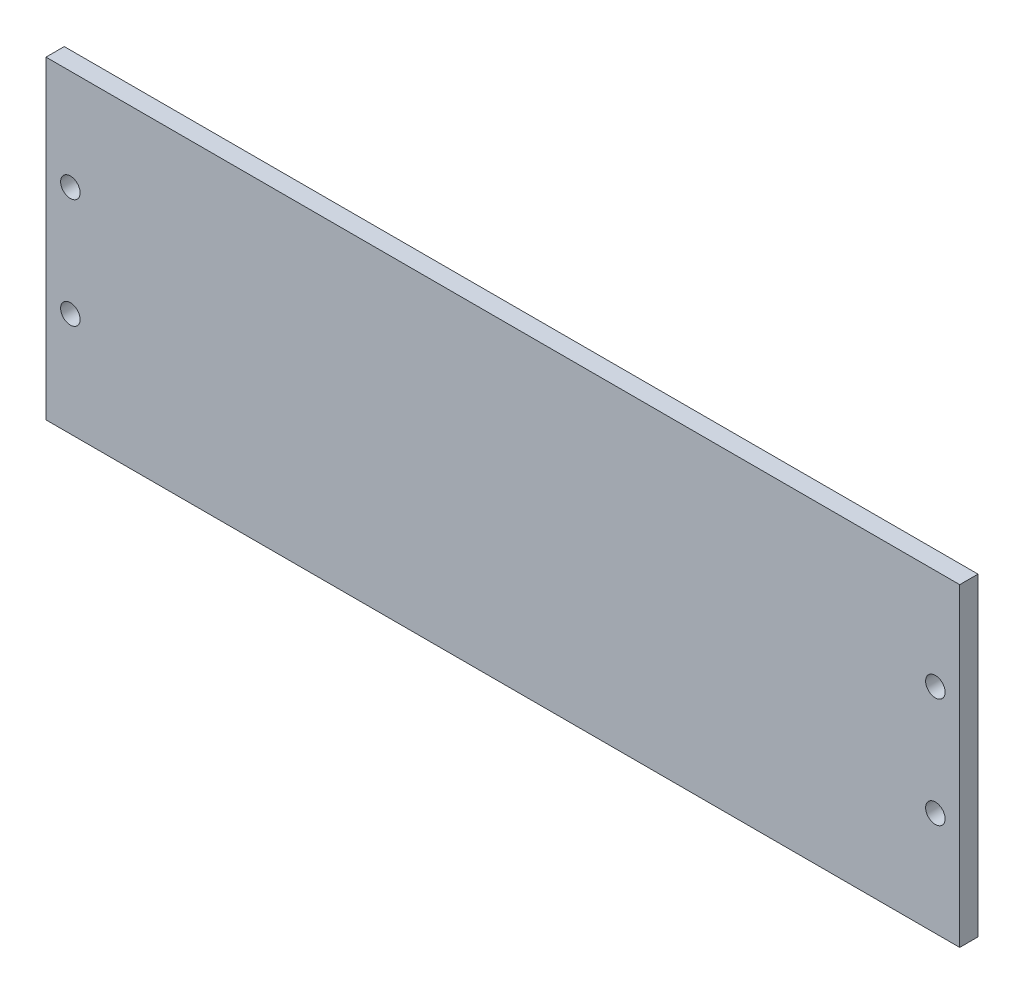
ISO-10303-21;
HEADER;
FILE_DESCRIPTION(('STEP AP214'),'2;1');
FILE_NAME('part.step','',(''),(''),'','','');
FILE_SCHEMA(('AUTOMOTIVE_DESIGN { 1 0 10303 214 1 1 1 1 }'));
ENDSEC;
DATA;
#1=APPLICATION_CONTEXT('core data for automotive mechanical design processes');
#2=APPLICATION_PROTOCOL_DEFINITION('international standard','automotive_design',2000,#1);
#3=PRODUCT_CONTEXT('',#1,'mechanical');
#4=PRODUCT('Part','Part','',(#3));
#5=PRODUCT_RELATED_PRODUCT_CATEGORY('part','',(#4));
#6=PRODUCT_DEFINITION_FORMATION('','',#4);
#7=PRODUCT_DEFINITION_CONTEXT('part definition',#1,'design');
#8=PRODUCT_DEFINITION('design','',#6,#7);
#9=PRODUCT_DEFINITION_SHAPE('','',#8);
#10=(LENGTH_UNIT() NAMED_UNIT(*) SI_UNIT(.MILLI.,.METRE.));
#11=(NAMED_UNIT(*) PLANE_ANGLE_UNIT() SI_UNIT($,.RADIAN.));
#12=(NAMED_UNIT(*) SI_UNIT($,.STERADIAN.) SOLID_ANGLE_UNIT());
#13=UNCERTAINTY_MEASURE_WITH_UNIT(LENGTH_MEASURE(1.E-05),#10,'distance_accuracy_value','');
#14=(GEOMETRIC_REPRESENTATION_CONTEXT(3) GLOBAL_UNCERTAINTY_ASSIGNED_CONTEXT((#13)) GLOBAL_UNIT_ASSIGNED_CONTEXT((#10,
#11,#12)) REPRESENTATION_CONTEXT('',''));
#15=CARTESIAN_POINT('',(0.,0.,0.));
#16=DIRECTION('',(0.,0.,1.));
#17=DIRECTION('',(1.,0.,0.));
#18=AXIS2_PLACEMENT_3D('',#15,#16,#17);
#19=CARTESIAN_POINT('',(-47.1117165948132,42.139739940599,-3.));
#20=DIRECTION('',(0.,-1.,0.));
#21=DIRECTION('',(1.,0.,0.));
#22=AXIS2_PLACEMENT_3D('',#19,#20,#21);
#23=PLANE('',#22);
#24=DIRECTION('',(1.,0.,0.));
#25=VECTOR('',#24,1.);
#26=CARTESIAN_POINT('',(-47.1117165948132,42.139739940599,0.));
#27=LINE('',#26,#25);
#28=CARTESIAN_POINT('',(-47.1117165948132,42.139739940599,0.));
#29=VERTEX_POINT('',#28);
#30=CARTESIAN_POINT('',(102.888283405187,42.139739940599,0.));
#31=VERTEX_POINT('',#30);
#32=EDGE_CURVE('E119',#29,#31,#27,.T.);
#33=ORIENTED_EDGE('',*,*,#32,.F.);
#34=DIRECTION('',(0.,0.,1.));
#35=VECTOR('',#34,1.);
#36=CARTESIAN_POINT('',(-47.1117165948132,42.139739940599,-3.));
#37=LINE('',#36,#35);
#38=CARTESIAN_POINT('',(-47.1117165948132,42.139739940599,-3.));
#39=VERTEX_POINT('',#38);
#40=EDGE_CURVE('E11',#39,#29,#37,.T.);
#41=ORIENTED_EDGE('',*,*,#40,.F.);
#42=DIRECTION('',(1.,0.,0.));
#43=VECTOR('',#42,1.);
#44=CARTESIAN_POINT('',(-47.1117165948132,42.139739940599,-3.));
#45=LINE('',#44,#43);
#46=CARTESIAN_POINT('',(102.888283405187,42.139739940599,-3.));
#47=VERTEX_POINT('',#46);
#48=EDGE_CURVE('E109',#39,#47,#45,.T.);
#49=ORIENTED_EDGE('',*,*,#48,.T.);
#50=DIRECTION('',(0.,0.,1.));
#51=VECTOR('',#50,1.);
#52=CARTESIAN_POINT('',(102.888283405187,42.139739940599,-3.));
#53=LINE('',#52,#51);
#54=EDGE_CURVE('E50',#47,#31,#53,.T.);
#55=ORIENTED_EDGE('',*,*,#54,.T.);
#56=EDGE_LOOP('',(#33,#41,#49,#55));
#57=FACE_BOUND('',#56,.T.);
#58=ADVANCED_FACE('F47',(#57),#23,.T.);
#59=CARTESIAN_POINT('',(-47.1117165948132,42.139739940599,-3.));
#60=DIRECTION('',(-1.,0.,0.));
#61=DIRECTION('',(0.,0.,1.));
#62=AXIS2_PLACEMENT_3D('',#59,#60,#61);
#63=PLANE('',#62);
#64=DIRECTION('',(0.,-1.,0.));
#65=VECTOR('',#64,1.);
#66=CARTESIAN_POINT('',(-47.1117165948132,42.139739940599,0.));
#67=LINE('',#66,#65);
#68=CARTESIAN_POINT('',(-47.1117165948132,93.7182566094569,0.));
#69=VERTEX_POINT('',#68);
#70=EDGE_CURVE('E113',#69,#29,#67,.T.);
#71=ORIENTED_EDGE('',*,*,#70,.F.);
#72=DIRECTION('',(0.,0.,1.));
#73=VECTOR('',#72,1.);
#74=CARTESIAN_POINT('',(-47.1117165948132,93.7182566094569,-3.));
#75=LINE('',#74,#73);
#76=CARTESIAN_POINT('',(-47.1117165948132,93.7182566094569,-3.));
#77=VERTEX_POINT('',#76);
#78=EDGE_CURVE('E57',#77,#69,#75,.T.);
#79=ORIENTED_EDGE('',*,*,#78,.F.);
#80=DIRECTION('',(0.,-1.,0.));
#81=VECTOR('',#80,1.);
#82=CARTESIAN_POINT('',(-47.1117165948132,42.139739940599,-3.));
#83=LINE('',#82,#81);
#84=EDGE_CURVE('E104',#77,#39,#83,.T.);
#85=ORIENTED_EDGE('',*,*,#84,.T.);
#86=ORIENTED_EDGE('',*,*,#40,.T.);
#87=EDGE_LOOP('',(#71,#79,#85,#86));
#88=FACE_BOUND('',#87,.T.);
#89=ADVANCED_FACE('F142',(#88),#63,.T.);
#90=CARTESIAN_POINT('',(-47.1117165948132,93.7182566094569,-3.));
#91=DIRECTION('',(0.,1.,0.));
#92=DIRECTION('',(-1.,0.,0.));
#93=AXIS2_PLACEMENT_3D('',#90,#91,#92);
#94=PLANE('',#93);
#95=DIRECTION('',(-1.,0.,0.));
#96=VECTOR('',#95,1.);
#97=CARTESIAN_POINT('',(-47.1117165948132,93.7182566094569,0.));
#98=LINE('',#97,#96);
#99=CARTESIAN_POINT('',(102.888283405187,93.7182566094569,0.));
#100=VERTEX_POINT('',#99);
#101=EDGE_CURVE('E98',#100,#69,#98,.T.);
#102=ORIENTED_EDGE('',*,*,#101,.F.);
#103=DIRECTION('',(0.,0.,1.));
#104=VECTOR('',#103,1.);
#105=CARTESIAN_POINT('',(102.888283405187,93.7182566094569,-3.));
#106=LINE('',#105,#104);
#107=CARTESIAN_POINT('',(102.888283405187,93.7182566094569,-3.));
#108=VERTEX_POINT('',#107);
#109=EDGE_CURVE('E93',#108,#100,#106,.T.);
#110=ORIENTED_EDGE('',*,*,#109,.F.);
#111=DIRECTION('',(-1.,0.,0.));
#112=VECTOR('',#111,1.);
#113=CARTESIAN_POINT('',(-47.1117165948132,93.7182566094569,-3.));
#114=LINE('',#113,#112);
#115=EDGE_CURVE('E96',#108,#77,#114,.T.);
#116=ORIENTED_EDGE('',*,*,#115,.T.);
#117=ORIENTED_EDGE('',*,*,#78,.T.);
#118=EDGE_LOOP('',(#102,#110,#116,#117));
#119=FACE_BOUND('',#118,.T.);
#120=ADVANCED_FACE('F95',(#119),#94,.T.);
#121=CARTESIAN_POINT('',(102.888283405187,42.139739940599,-3.));
#122=DIRECTION('',(1.,0.,0.));
#123=DIRECTION('',(0.,0.,-1.));
#124=AXIS2_PLACEMENT_3D('',#121,#122,#123);
#125=PLANE('',#124);
#126=DIRECTION('',(0.,1.,0.));
#127=VECTOR('',#126,1.);
#128=CARTESIAN_POINT('',(102.888283405187,42.139739940599,0.));
#129=LINE('',#128,#127);
#130=EDGE_CURVE('E123',#31,#100,#129,.T.);
#131=ORIENTED_EDGE('',*,*,#130,.F.);
#132=ORIENTED_EDGE('',*,*,#54,.F.);
#133=DIRECTION('',(0.,1.,0.));
#134=VECTOR('',#133,1.);
#135=CARTESIAN_POINT('',(102.888283405187,42.139739940599,-3.));
#136=LINE('',#135,#134);
#137=EDGE_CURVE('E103',#47,#108,#136,.T.);
#138=ORIENTED_EDGE('',*,*,#137,.T.);
#139=ORIENTED_EDGE('',*,*,#109,.T.);
#140=EDGE_LOOP('',(#131,#132,#138,#139));
#141=FACE_BOUND('',#140,.T.);
#142=ADVANCED_FACE('F107',(#141),#125,.T.);
#143=CARTESIAN_POINT('',(0.,0.,-3.));
#144=DIRECTION('',(0.,0.,1.));
#145=DIRECTION('',(1.,0.,0.));
#146=AXIS2_PLACEMENT_3D('',#143,#144,#145);
#147=PLANE('',#146);
#148=CARTESIAN_POINT('',(98.8882834051867,77.2182566094569,-3.));
#149=DIRECTION('',(0.,0.,1.));
#150=DIRECTION('',(-1.,0.,0.));
#151=AXIS2_PLACEMENT_3D('',#148,#149,#150);
#152=CIRCLE('',#151,1.59999999999996);
#153=CARTESIAN_POINT('',(97.2882834051868,77.2182566094569,-3.));
#154=VERTEX_POINT('',#153);
#155=EDGE_CURVE('E183',#154,#154,#152,.T.);
#156=ORIENTED_EDGE('',*,*,#155,.T.);
#157=EDGE_LOOP('',(#156));
#158=FACE_BOUND('',#157,.T.);
#159=CARTESIAN_POINT('',(98.8882834051867,59.2182566094569,-3.));
#160=DIRECTION('',(0.,0.,1.));
#161=DIRECTION('',(-1.,0.,0.));
#162=AXIS2_PLACEMENT_3D('',#159,#160,#161);
#163=CIRCLE('',#162,1.59999999999997);
#164=CARTESIAN_POINT('',(97.2882834051868,59.2182566094569,-3.));
#165=VERTEX_POINT('',#164);
#166=EDGE_CURVE('E194',#165,#165,#163,.T.);
#167=ORIENTED_EDGE('',*,*,#166,.T.);
#168=EDGE_LOOP('',(#167));
#169=FACE_BOUND('',#168,.T.);
#170=CARTESIAN_POINT('',(-43.1117165948132,59.2182566094569,-3.));
#171=DIRECTION('',(0.,0.,1.));
#172=DIRECTION('',(1.,0.,0.));
#173=AXIS2_PLACEMENT_3D('',#170,#171,#172);
#174=CIRCLE('',#173,1.60000000000001);
#175=CARTESIAN_POINT('',(-41.5117165948132,59.2182566094569,-3.));
#176=VERTEX_POINT('',#175);
#177=EDGE_CURVE('E202',#176,#176,#174,.T.);
#178=ORIENTED_EDGE('',*,*,#177,.T.);
#179=EDGE_LOOP('',(#178));
#180=FACE_BOUND('',#179,.T.);
#181=CARTESIAN_POINT('',(-43.1117165948132,77.2182566094569,-3.));
#182=DIRECTION('',(0.,0.,1.));
#183=DIRECTION('',(1.,0.,0.));
#184=AXIS2_PLACEMENT_3D('',#181,#182,#183);
#185=CIRCLE('',#184,1.59999999999998);
#186=CARTESIAN_POINT('',(-41.5117165948132,77.2182566094569,-3.));
#187=VERTEX_POINT('',#186);
#188=EDGE_CURVE('E124',#187,#187,#185,.T.);
#189=ORIENTED_EDGE('',*,*,#188,.T.);
#190=EDGE_LOOP('',(#189));
#191=FACE_BOUND('',#190,.T.);
#192=ORIENTED_EDGE('',*,*,#48,.F.);
#193=ORIENTED_EDGE('',*,*,#84,.F.);
#194=ORIENTED_EDGE('',*,*,#115,.F.);
#195=ORIENTED_EDGE('',*,*,#137,.F.);
#196=EDGE_LOOP('',(#192,#193,#194,#195));
#197=FACE_BOUND('',#196,.T.);
#198=ADVANCED_FACE('F102',(#158,#169,#180,#191,#197),#147,.F.);
#199=CARTESIAN_POINT('',(0.,0.,0.));
#200=DIRECTION('',(0.,0.,1.));
#201=DIRECTION('',(1.,0.,0.));
#202=AXIS2_PLACEMENT_3D('',#199,#200,#201);
#203=PLANE('',#202);
#204=CARTESIAN_POINT('',(98.8882834051867,77.2182566094569,0.));
#205=DIRECTION('',(0.,0.,1.));
#206=DIRECTION('',(-1.,0.,0.));
#207=AXIS2_PLACEMENT_3D('',#204,#205,#206);
#208=CIRCLE('',#207,1.59999999999996);
#209=CARTESIAN_POINT('',(97.2882834051868,77.2182566094569,0.));
#210=VERTEX_POINT('',#209);
#211=EDGE_CURVE('E186',#210,#210,#208,.T.);
#212=ORIENTED_EDGE('',*,*,#211,.F.);
#213=EDGE_LOOP('',(#212));
#214=FACE_BOUND('',#213,.T.);
#215=CARTESIAN_POINT('',(98.8882834051867,59.2182566094569,0.));
#216=DIRECTION('',(0.,0.,1.));
#217=DIRECTION('',(-1.,0.,0.));
#218=AXIS2_PLACEMENT_3D('',#215,#216,#217);
#219=CIRCLE('',#218,1.59999999999997);
#220=CARTESIAN_POINT('',(97.2882834051868,59.2182566094569,0.));
#221=VERTEX_POINT('',#220);
#222=EDGE_CURVE('E191',#221,#221,#219,.T.);
#223=ORIENTED_EDGE('',*,*,#222,.F.);
#224=EDGE_LOOP('',(#223));
#225=FACE_BOUND('',#224,.T.);
#226=CARTESIAN_POINT('',(-43.1117165948132,59.2182566094569,0.));
#227=DIRECTION('',(0.,0.,1.));
#228=DIRECTION('',(1.,0.,0.));
#229=AXIS2_PLACEMENT_3D('',#226,#227,#228);
#230=CIRCLE('',#229,1.60000000000001);
#231=CARTESIAN_POINT('',(-41.5117165948132,59.2182566094569,0.));
#232=VERTEX_POINT('',#231);
#233=EDGE_CURVE('E198',#232,#232,#230,.T.);
#234=ORIENTED_EDGE('',*,*,#233,.F.);
#235=EDGE_LOOP('',(#234));
#236=FACE_BOUND('',#235,.T.);
#237=CARTESIAN_POINT('',(-43.1117165948132,77.2182566094569,0.));
#238=DIRECTION('',(0.,0.,1.));
#239=DIRECTION('',(1.,0.,0.));
#240=AXIS2_PLACEMENT_3D('',#237,#238,#239);
#241=CIRCLE('',#240,1.59999999999998);
#242=CARTESIAN_POINT('',(-41.5117165948132,77.2182566094569,0.));
#243=VERTEX_POINT('',#242);
#244=EDGE_CURVE('E206',#243,#243,#241,.T.);
#245=ORIENTED_EDGE('',*,*,#244,.F.);
#246=EDGE_LOOP('',(#245));
#247=FACE_BOUND('',#246,.T.);
#248=ORIENTED_EDGE('',*,*,#32,.T.);
#249=ORIENTED_EDGE('',*,*,#130,.T.);
#250=ORIENTED_EDGE('',*,*,#101,.T.);
#251=ORIENTED_EDGE('',*,*,#70,.T.);
#252=EDGE_LOOP('',(#248,#249,#250,#251));
#253=FACE_BOUND('',#252,.T.);
#254=ADVANCED_FACE('F141',(#214,#225,#236,#247,#253),#203,.T.);
#255=CARTESIAN_POINT('',(-43.1117165948132,77.2182566094569,-3.));
#256=DIRECTION('',(0.,0.,1.));
#257=DIRECTION('',(1.,0.,0.));
#258=AXIS2_PLACEMENT_3D('',#255,#256,#257);
#259=CYLINDRICAL_SURFACE('',#258,1.59999999999998);
#260=ORIENTED_EDGE('',*,*,#188,.F.);
#261=EDGE_LOOP('',(#260));
#262=FACE_BOUND('',#261,.T.);
#263=ORIENTED_EDGE('',*,*,#244,.T.);
#264=EDGE_LOOP('',(#263));
#265=FACE_BOUND('',#264,.T.);
#266=ADVANCED_FACE('F160',(#262,#265),#259,.F.);
#267=CARTESIAN_POINT('',(-43.1117165948132,59.2182566094569,-3.));
#268=DIRECTION('',(0.,0.,1.));
#269=DIRECTION('',(1.,0.,0.));
#270=AXIS2_PLACEMENT_3D('',#267,#268,#269);
#271=CYLINDRICAL_SURFACE('',#270,1.60000000000001);
#272=ORIENTED_EDGE('',*,*,#177,.F.);
#273=EDGE_LOOP('',(#272));
#274=FACE_BOUND('',#273,.T.);
#275=ORIENTED_EDGE('',*,*,#233,.T.);
#276=EDGE_LOOP('',(#275));
#277=FACE_BOUND('',#276,.T.);
#278=ADVANCED_FACE('F167',(#274,#277),#271,.F.);
#279=CARTESIAN_POINT('',(98.8882834051867,59.2182566094569,-3.));
#280=DIRECTION('',(0.,0.,1.));
#281=DIRECTION('',(1.,0.,0.));
#282=AXIS2_PLACEMENT_3D('',#279,#280,#281);
#283=CYLINDRICAL_SURFACE('',#282,1.59999999999997);
#284=ORIENTED_EDGE('',*,*,#166,.F.);
#285=EDGE_LOOP('',(#284));
#286=FACE_BOUND('',#285,.T.);
#287=ORIENTED_EDGE('',*,*,#222,.T.);
#288=EDGE_LOOP('',(#287));
#289=FACE_BOUND('',#288,.T.);
#290=ADVANCED_FACE('F171',(#286,#289),#283,.F.);
#291=CARTESIAN_POINT('',(98.8882834051867,77.2182566094569,-3.));
#292=DIRECTION('',(0.,0.,1.));
#293=DIRECTION('',(1.,0.,0.));
#294=AXIS2_PLACEMENT_3D('',#291,#292,#293);
#295=CYLINDRICAL_SURFACE('',#294,1.59999999999996);
#296=ORIENTED_EDGE('',*,*,#155,.F.);
#297=EDGE_LOOP('',(#296));
#298=FACE_BOUND('',#297,.T.);
#299=ORIENTED_EDGE('',*,*,#211,.T.);
#300=EDGE_LOOP('',(#299));
#301=FACE_BOUND('',#300,.T.);
#302=ADVANCED_FACE('F175',(#298,#301),#295,.F.);
#303=CLOSED_SHELL('',(#58,#89,#120,#142,#198,#254,#266,#278,#290,#302));
#304=MANIFOLD_SOLID_BREP('B2',#303);
#305=ADVANCED_BREP_SHAPE_REPRESENTATION('',(#18,#304),#14);
#306=SHAPE_DEFINITION_REPRESENTATION(#9,#305);
ENDSEC;
END-ISO-10303-21;
